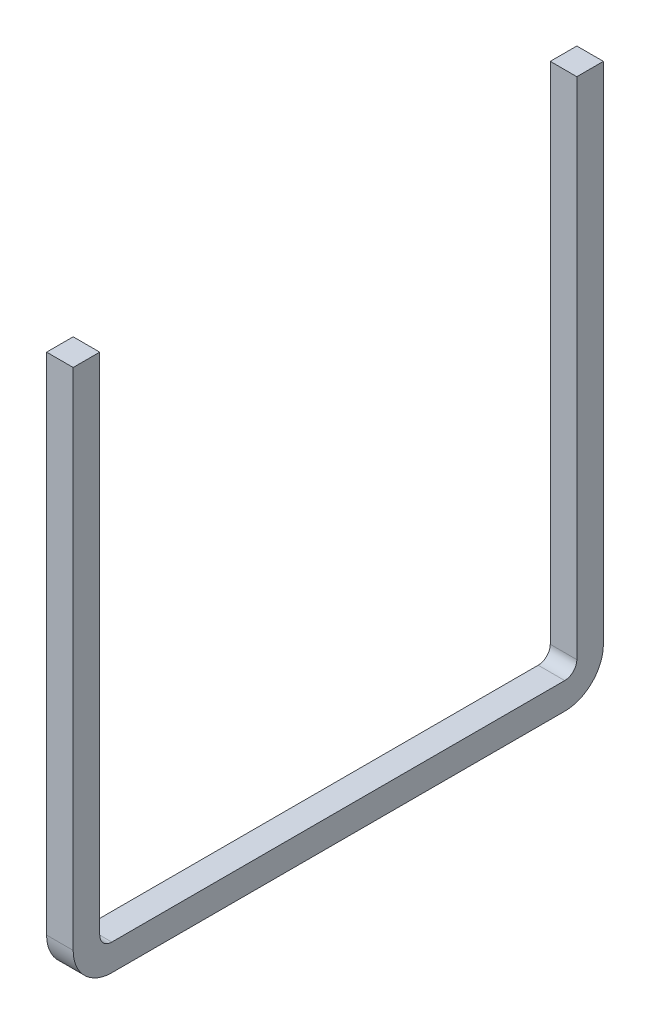
ISO-10303-21;
HEADER;
FILE_DESCRIPTION(('STEP AP214'),'2;1');
FILE_NAME('part.step','',(''),(''),'','','');
FILE_SCHEMA(('AUTOMOTIVE_DESIGN { 1 0 10303 214 1 1 1 1 }'));
ENDSEC;
DATA;
#1=APPLICATION_CONTEXT('core data for automotive mechanical design processes');
#2=APPLICATION_PROTOCOL_DEFINITION('international standard','automotive_design',2000,#1);
#3=PRODUCT_CONTEXT('',#1,'mechanical');
#4=PRODUCT('Part','Part','',(#3));
#5=PRODUCT_RELATED_PRODUCT_CATEGORY('part','',(#4));
#6=PRODUCT_DEFINITION_FORMATION('','',#4);
#7=PRODUCT_DEFINITION_CONTEXT('part definition',#1,'design');
#8=PRODUCT_DEFINITION('design','',#6,#7);
#9=PRODUCT_DEFINITION_SHAPE('','',#8);
#10=(LENGTH_UNIT() NAMED_UNIT(*) SI_UNIT(.MILLI.,.METRE.));
#11=(NAMED_UNIT(*) PLANE_ANGLE_UNIT() SI_UNIT($,.RADIAN.));
#12=(NAMED_UNIT(*) SI_UNIT($,.STERADIAN.) SOLID_ANGLE_UNIT());
#13=UNCERTAINTY_MEASURE_WITH_UNIT(LENGTH_MEASURE(1.E-05),#10,'distance_accuracy_value','');
#14=(GEOMETRIC_REPRESENTATION_CONTEXT(3) GLOBAL_UNCERTAINTY_ASSIGNED_CONTEXT((#13)) GLOBAL_UNIT_ASSIGNED_CONTEXT((#10,
#11,#12)) REPRESENTATION_CONTEXT('',''));
#15=CARTESIAN_POINT('',(0.,0.,0.));
#16=DIRECTION('',(0.,0.,1.));
#17=DIRECTION('',(1.,0.,0.));
#18=AXIS2_PLACEMENT_3D('',#15,#16,#17);
#19=CARTESIAN_POINT('',(5.588,114.3,-55.753));
#20=DIRECTION('',(0.,-1.,0.));
#21=DIRECTION('',(0.,0.,-1.));
#22=AXIS2_PLACEMENT_3D('',#19,#20,#21);
#23=PLANE('',#22);
#24=DIRECTION('',(0.,0.,1.));
#25=VECTOR('',#24,1.);
#26=CARTESIAN_POINT('',(0.,114.3,-55.753));
#27=LINE('',#26,#25);
#28=CARTESIAN_POINT('',(0.,114.3,-55.753));
#29=VERTEX_POINT('',#28);
#30=CARTESIAN_POINT('',(0.,114.3,-50.165));
#31=VERTEX_POINT('',#30);
#32=EDGE_CURVE('E162',#29,#31,#27,.T.);
#33=ORIENTED_EDGE('',*,*,#32,.T.);
#34=DIRECTION('',(-1.,0.,0.));
#35=VECTOR('',#34,1.);
#36=CARTESIAN_POINT('',(5.588,114.3,-50.165));
#37=LINE('',#36,#35);
#38=CARTESIAN_POINT('',(5.588,114.3,-50.165));
#39=VERTEX_POINT('',#38);
#40=EDGE_CURVE('E13',#39,#31,#37,.T.);
#41=ORIENTED_EDGE('',*,*,#40,.F.);
#42=DIRECTION('',(0.,0.,1.));
#43=VECTOR('',#42,1.);
#44=CARTESIAN_POINT('',(5.588,114.3,-55.753));
#45=LINE('',#44,#43);
#46=CARTESIAN_POINT('',(5.588,114.3,-55.753));
#47=VERTEX_POINT('',#46);
#48=EDGE_CURVE('E184',#47,#39,#45,.T.);
#49=ORIENTED_EDGE('',*,*,#48,.F.);
#50=DIRECTION('',(-1.,0.,0.));
#51=VECTOR('',#50,1.);
#52=CARTESIAN_POINT('',(5.588,114.3,-55.753));
#53=LINE('',#52,#51);
#54=EDGE_CURVE('E158',#47,#29,#53,.T.);
#55=ORIENTED_EDGE('',*,*,#54,.T.);
#56=EDGE_LOOP('',(#33,#41,#49,#55));
#57=FACE_BOUND('',#56,.T.);
#58=ADVANCED_FACE('F42',(#57),#23,.F.);
#59=CARTESIAN_POINT('',(5.588,114.3,-50.165));
#60=DIRECTION('',(0.,0.,-1.));
#61=DIRECTION('',(0.,1.,0.));
#62=AXIS2_PLACEMENT_3D('',#59,#60,#61);
#63=PLANE('',#62);
#64=DIRECTION('',(0.,-1.,0.));
#65=VECTOR('',#64,1.);
#66=CARTESIAN_POINT('',(0.,114.3,-50.165));
#67=LINE('',#66,#65);
#68=CARTESIAN_POINT('',(0.,8.128,-50.165));
#69=VERTEX_POINT('',#68);
#70=EDGE_CURVE('E165',#31,#69,#67,.T.);
#71=ORIENTED_EDGE('',*,*,#70,.T.);
#72=DIRECTION('',(-1.,0.,0.));
#73=VECTOR('',#72,1.);
#74=CARTESIAN_POINT('',(5.588,8.128,-50.165));
#75=LINE('',#74,#73);
#76=CARTESIAN_POINT('',(5.588,8.128,-50.165));
#77=VERTEX_POINT('',#76);
#78=EDGE_CURVE('E50',#77,#69,#75,.T.);
#79=ORIENTED_EDGE('',*,*,#78,.F.);
#80=DIRECTION('',(0.,-1.,0.));
#81=VECTOR('',#80,1.);
#82=CARTESIAN_POINT('',(5.588,114.3,-50.165));
#83=LINE('',#82,#81);
#84=EDGE_CURVE('E113',#39,#77,#83,.T.);
#85=ORIENTED_EDGE('',*,*,#84,.F.);
#86=ORIENTED_EDGE('',*,*,#40,.T.);
#87=EDGE_LOOP('',(#71,#79,#85,#86));
#88=FACE_BOUND('',#87,.T.);
#89=ADVANCED_FACE('F262',(#88),#63,.F.);
#90=CARTESIAN_POINT('',(5.588,8.128,-47.625));
#91=DIRECTION('',(-1.,0.,0.));
#92=DIRECTION('',(0.,0.,1.));
#93=AXIS2_PLACEMENT_3D('',#90,#91,#92);
#94=CYLINDRICAL_SURFACE('',#93,2.54);
#95=CARTESIAN_POINT('',(0.,8.128,-47.625));
#96=DIRECTION('',(-1.,0.,0.));
#97=DIRECTION('',(0.,0.,-1.));
#98=AXIS2_PLACEMENT_3D('',#95,#96,#97);
#99=CIRCLE('',#98,2.54);
#100=CARTESIAN_POINT('',(0.,5.588,-47.625));
#101=VERTEX_POINT('',#100);
#102=EDGE_CURVE('E167',#69,#101,#99,.T.);
#103=ORIENTED_EDGE('',*,*,#102,.T.);
#104=DIRECTION('',(-1.,0.,0.));
#105=VECTOR('',#104,1.);
#106=CARTESIAN_POINT('',(5.588,5.588,-47.625));
#107=LINE('',#106,#105);
#108=CARTESIAN_POINT('',(5.588,5.588,-47.625));
#109=VERTEX_POINT('',#108);
#110=EDGE_CURVE('E203',#109,#101,#107,.T.);
#111=ORIENTED_EDGE('',*,*,#110,.F.);
#112=CARTESIAN_POINT('',(5.588,8.128,-47.625));
#113=DIRECTION('',(-1.,0.,0.));
#114=DIRECTION('',(0.,0.,-1.));
#115=AXIS2_PLACEMENT_3D('',#112,#113,#114);
#116=CIRCLE('',#115,2.54);
#117=EDGE_CURVE('E211',#77,#109,#116,.T.);
#118=ORIENTED_EDGE('',*,*,#117,.F.);
#119=ORIENTED_EDGE('',*,*,#78,.T.);
#120=EDGE_LOOP('',(#103,#111,#118,#119));
#121=FACE_BOUND('',#120,.T.);
#122=ADVANCED_FACE('F209',(#121),#94,.F.);
#123=CARTESIAN_POINT('',(5.588,5.588,-47.625));
#124=DIRECTION('',(0.,-1.,0.));
#125=DIRECTION('',(0.,0.,-1.));
#126=AXIS2_PLACEMENT_3D('',#123,#124,#125);
#127=PLANE('',#126);
#128=DIRECTION('',(0.,0.,1.));
#129=VECTOR('',#128,1.);
#130=CARTESIAN_POINT('',(0.,5.588,-47.625));
#131=LINE('',#130,#129);
#132=CARTESIAN_POINT('',(0.,5.588,47.625));
#133=VERTEX_POINT('',#132);
#134=EDGE_CURVE('E169',#101,#133,#131,.T.);
#135=ORIENTED_EDGE('',*,*,#134,.T.);
#136=DIRECTION('',(-1.,0.,0.));
#137=VECTOR('',#136,1.);
#138=CARTESIAN_POINT('',(5.588,5.588,47.625));
#139=LINE('',#138,#137);
#140=CARTESIAN_POINT('',(5.588,5.588,47.625));
#141=VERTEX_POINT('',#140);
#142=EDGE_CURVE('E200',#141,#133,#139,.T.);
#143=ORIENTED_EDGE('',*,*,#142,.F.);
#144=DIRECTION('',(0.,0.,1.));
#145=VECTOR('',#144,1.);
#146=CARTESIAN_POINT('',(5.588,5.588,-47.625));
#147=LINE('',#146,#145);
#148=EDGE_CURVE('E229',#109,#141,#147,.T.);
#149=ORIENTED_EDGE('',*,*,#148,.F.);
#150=ORIENTED_EDGE('',*,*,#110,.T.);
#151=EDGE_LOOP('',(#135,#143,#149,#150));
#152=FACE_BOUND('',#151,.T.);
#153=ADVANCED_FACE('F220',(#152),#127,.F.);
#154=CARTESIAN_POINT('',(5.588,8.12799999999999,47.625));
#155=DIRECTION('',(-1.,0.,0.));
#156=DIRECTION('',(0.,0.,1.));
#157=AXIS2_PLACEMENT_3D('',#154,#155,#156);
#158=CYLINDRICAL_SURFACE('',#157,2.54);
#159=CARTESIAN_POINT('',(0.,8.12799999999999,47.625));
#160=DIRECTION('',(-1.,0.,0.));
#161=DIRECTION('',(0.,0.,-1.));
#162=AXIS2_PLACEMENT_3D('',#159,#160,#161);
#163=CIRCLE('',#162,2.54);
#164=CARTESIAN_POINT('',(0.,8.12799999999999,50.165));
#165=VERTEX_POINT('',#164);
#166=EDGE_CURVE('E171',#133,#165,#163,.T.);
#167=ORIENTED_EDGE('',*,*,#166,.T.);
#168=DIRECTION('',(-1.,0.,0.));
#169=VECTOR('',#168,1.);
#170=CARTESIAN_POINT('',(5.588,8.12799999999999,50.165));
#171=LINE('',#170,#169);
#172=CARTESIAN_POINT('',(5.588,8.12799999999999,50.165));
#173=VERTEX_POINT('',#172);
#174=EDGE_CURVE('E197',#173,#165,#171,.T.);
#175=ORIENTED_EDGE('',*,*,#174,.F.);
#176=CARTESIAN_POINT('',(5.588,8.12799999999999,47.625));
#177=DIRECTION('',(-1.,0.,0.));
#178=DIRECTION('',(0.,0.,-1.));
#179=AXIS2_PLACEMENT_3D('',#176,#177,#178);
#180=CIRCLE('',#179,2.54);
#181=EDGE_CURVE('E226',#141,#173,#180,.T.);
#182=ORIENTED_EDGE('',*,*,#181,.F.);
#183=ORIENTED_EDGE('',*,*,#142,.T.);
#184=EDGE_LOOP('',(#167,#175,#182,#183));
#185=FACE_BOUND('',#184,.T.);
#186=ADVANCED_FACE('F224',(#185),#158,.F.);
#187=CARTESIAN_POINT('',(5.588,8.12799999999999,50.165));
#188=DIRECTION('',(0.,0.,1.));
#189=DIRECTION('',(0.,-1.,0.));
#190=AXIS2_PLACEMENT_3D('',#187,#188,#189);
#191=PLANE('',#190);
#192=DIRECTION('',(0.,1.,0.));
#193=VECTOR('',#192,1.);
#194=CARTESIAN_POINT('',(0.,8.12799999999999,50.165));
#195=LINE('',#194,#193);
#196=CARTESIAN_POINT('',(0.,114.3,50.165));
#197=VERTEX_POINT('',#196);
#198=EDGE_CURVE('E173',#165,#197,#195,.T.);
#199=ORIENTED_EDGE('',*,*,#198,.T.);
#200=DIRECTION('',(-1.,0.,0.));
#201=VECTOR('',#200,1.);
#202=CARTESIAN_POINT('',(5.588,114.3,50.165));
#203=LINE('',#202,#201);
#204=CARTESIAN_POINT('',(5.588,114.3,50.165));
#205=VERTEX_POINT('',#204);
#206=EDGE_CURVE('E194',#205,#197,#203,.T.);
#207=ORIENTED_EDGE('',*,*,#206,.F.);
#208=DIRECTION('',(0.,1.,0.));
#209=VECTOR('',#208,1.);
#210=CARTESIAN_POINT('',(5.588,8.12799999999999,50.165));
#211=LINE('',#210,#209);
#212=EDGE_CURVE('E228',#173,#205,#211,.T.);
#213=ORIENTED_EDGE('',*,*,#212,.F.);
#214=ORIENTED_EDGE('',*,*,#174,.T.);
#215=EDGE_LOOP('',(#199,#207,#213,#214));
#216=FACE_BOUND('',#215,.T.);
#217=ADVANCED_FACE('F275',(#216),#191,.F.);
#218=CARTESIAN_POINT('',(5.588,114.3,50.165));
#219=DIRECTION('',(0.,-1.,0.));
#220=DIRECTION('',(0.,0.,-1.));
#221=AXIS2_PLACEMENT_3D('',#218,#219,#220);
#222=PLANE('',#221);
#223=DIRECTION('',(0.,0.,1.));
#224=VECTOR('',#223,1.);
#225=CARTESIAN_POINT('',(0.,114.3,50.165));
#226=LINE('',#225,#224);
#227=CARTESIAN_POINT('',(0.,114.3,55.753));
#228=VERTEX_POINT('',#227);
#229=EDGE_CURVE('E175',#197,#228,#226,.T.);
#230=ORIENTED_EDGE('',*,*,#229,.T.);
#231=DIRECTION('',(-1.,0.,0.));
#232=VECTOR('',#231,1.);
#233=CARTESIAN_POINT('',(5.588,114.3,55.753));
#234=LINE('',#233,#232);
#235=CARTESIAN_POINT('',(5.588,114.3,55.753));
#236=VERTEX_POINT('',#235);
#237=EDGE_CURVE('E191',#236,#228,#234,.T.);
#238=ORIENTED_EDGE('',*,*,#237,.F.);
#239=DIRECTION('',(0.,0.,1.));
#240=VECTOR('',#239,1.);
#241=CARTESIAN_POINT('',(5.588,114.3,50.165));
#242=LINE('',#241,#240);
#243=EDGE_CURVE('E231',#205,#236,#242,.T.);
#244=ORIENTED_EDGE('',*,*,#243,.F.);
#245=ORIENTED_EDGE('',*,*,#206,.T.);
#246=EDGE_LOOP('',(#230,#238,#244,#245));
#247=FACE_BOUND('',#246,.T.);
#248=ADVANCED_FACE('F278',(#247),#222,.F.);
#249=CARTESIAN_POINT('',(5.588,114.3,55.753));
#250=DIRECTION('',(0.,0.,-1.));
#251=DIRECTION('',(0.,1.,0.));
#252=AXIS2_PLACEMENT_3D('',#249,#250,#251);
#253=PLANE('',#252);
#254=DIRECTION('',(0.,-1.,0.));
#255=VECTOR('',#254,1.);
#256=CARTESIAN_POINT('',(0.,114.3,55.753));
#257=LINE('',#256,#255);
#258=CARTESIAN_POINT('',(0.,8.128,55.753));
#259=VERTEX_POINT('',#258);
#260=EDGE_CURVE('E177',#228,#259,#257,.T.);
#261=ORIENTED_EDGE('',*,*,#260,.T.);
#262=DIRECTION('',(-1.,0.,0.));
#263=VECTOR('',#262,1.);
#264=CARTESIAN_POINT('',(5.588,8.128,55.753));
#265=LINE('',#264,#263);
#266=CARTESIAN_POINT('',(5.588,8.128,55.753));
#267=VERTEX_POINT('',#266);
#268=EDGE_CURVE('E188',#267,#259,#265,.T.);
#269=ORIENTED_EDGE('',*,*,#268,.F.);
#270=DIRECTION('',(0.,-1.,0.));
#271=VECTOR('',#270,1.);
#272=CARTESIAN_POINT('',(5.588,114.3,55.753));
#273=LINE('',#272,#271);
#274=EDGE_CURVE('E237',#236,#267,#273,.T.);
#275=ORIENTED_EDGE('',*,*,#274,.F.);
#276=ORIENTED_EDGE('',*,*,#237,.T.);
#277=EDGE_LOOP('',(#261,#269,#275,#276));
#278=FACE_BOUND('',#277,.T.);
#279=ADVANCED_FACE('F243',(#278),#253,.F.);
#280=CARTESIAN_POINT('',(5.588,8.12799999999999,47.625));
#281=DIRECTION('',(-1.,0.,0.));
#282=DIRECTION('',(0.,0.,1.));
#283=AXIS2_PLACEMENT_3D('',#280,#281,#282);
#284=CYLINDRICAL_SURFACE('',#283,8.128);
#285=CARTESIAN_POINT('',(0.,8.12799999999999,47.625));
#286=DIRECTION('',(1.,0.,0.));
#287=DIRECTION('',(0.,0.,-1.));
#288=AXIS2_PLACEMENT_3D('',#285,#286,#287);
#289=CIRCLE('',#288,8.128);
#290=CARTESIAN_POINT('',(0.,0.,47.625));
#291=VERTEX_POINT('',#290);
#292=EDGE_CURVE('E179',#259,#291,#289,.T.);
#293=ORIENTED_EDGE('',*,*,#292,.T.);
#294=DIRECTION('',(-1.,0.,0.));
#295=VECTOR('',#294,1.);
#296=CARTESIAN_POINT('',(5.588,0.,47.625));
#297=LINE('',#296,#295);
#298=CARTESIAN_POINT('',(5.588,0.,47.625));
#299=VERTEX_POINT('',#298);
#300=EDGE_CURVE('E153',#299,#291,#297,.T.);
#301=ORIENTED_EDGE('',*,*,#300,.F.);
#302=CARTESIAN_POINT('',(5.588,8.12799999999999,47.625));
#303=DIRECTION('',(1.,0.,0.));
#304=DIRECTION('',(0.,0.,-1.));
#305=AXIS2_PLACEMENT_3D('',#302,#303,#304);
#306=CIRCLE('',#305,8.128);
#307=EDGE_CURVE('E144',#267,#299,#306,.T.);
#308=ORIENTED_EDGE('',*,*,#307,.F.);
#309=ORIENTED_EDGE('',*,*,#268,.T.);
#310=EDGE_LOOP('',(#293,#301,#308,#309));
#311=FACE_BOUND('',#310,.T.);
#312=ADVANCED_FACE('F247',(#311),#284,.T.);
#313=CARTESIAN_POINT('',(5.588,0.,47.625));
#314=DIRECTION('',(0.,1.,0.));
#315=DIRECTION('',(0.,0.,1.));
#316=AXIS2_PLACEMENT_3D('',#313,#314,#315);
#317=PLANE('',#316);
#318=DIRECTION('',(0.,0.,-1.));
#319=VECTOR('',#318,1.);
#320=CARTESIAN_POINT('',(0.,0.,47.625));
#321=LINE('',#320,#319);
#322=CARTESIAN_POINT('',(0.,0.,-47.625));
#323=VERTEX_POINT('',#322);
#324=EDGE_CURVE('E152',#291,#323,#321,.T.);
#325=ORIENTED_EDGE('',*,*,#324,.T.);
#326=DIRECTION('',(-1.,0.,0.));
#327=VECTOR('',#326,1.);
#328=CARTESIAN_POINT('',(5.588,0.,-47.625));
#329=LINE('',#328,#327);
#330=CARTESIAN_POINT('',(5.588,0.,-47.625));
#331=VERTEX_POINT('',#330);
#332=EDGE_CURVE('E149',#331,#323,#329,.T.);
#333=ORIENTED_EDGE('',*,*,#332,.F.);
#334=DIRECTION('',(0.,0.,-1.));
#335=VECTOR('',#334,1.);
#336=CARTESIAN_POINT('',(5.588,0.,47.625));
#337=LINE('',#336,#335);
#338=EDGE_CURVE('E138',#299,#331,#337,.T.);
#339=ORIENTED_EDGE('',*,*,#338,.F.);
#340=ORIENTED_EDGE('',*,*,#300,.T.);
#341=EDGE_LOOP('',(#325,#333,#339,#340));
#342=FACE_BOUND('',#341,.T.);
#343=ADVANCED_FACE('F150',(#342),#317,.F.);
#344=CARTESIAN_POINT('',(5.588,8.128,-47.625));
#345=DIRECTION('',(-1.,0.,0.));
#346=DIRECTION('',(0.,0.,1.));
#347=AXIS2_PLACEMENT_3D('',#344,#345,#346);
#348=CYLINDRICAL_SURFACE('',#347,8.12799999999999);
#349=CARTESIAN_POINT('',(0.,8.128,-47.625));
#350=DIRECTION('',(1.,0.,0.));
#351=DIRECTION('',(0.,0.,-1.));
#352=AXIS2_PLACEMENT_3D('',#349,#350,#351);
#353=CIRCLE('',#352,8.12799999999999);
#354=CARTESIAN_POINT('',(0.,8.128,-55.753));
#355=VERTEX_POINT('',#354);
#356=EDGE_CURVE('E99',#323,#355,#353,.T.);
#357=ORIENTED_EDGE('',*,*,#356,.T.);
#358=DIRECTION('',(-1.,0.,0.));
#359=VECTOR('',#358,1.);
#360=CARTESIAN_POINT('',(5.588,8.128,-55.753));
#361=LINE('',#360,#359);
#362=CARTESIAN_POINT('',(5.588,8.128,-55.753));
#363=VERTEX_POINT('',#362);
#364=EDGE_CURVE('E154',#363,#355,#361,.T.);
#365=ORIENTED_EDGE('',*,*,#364,.F.);
#366=CARTESIAN_POINT('',(5.588,8.128,-47.625));
#367=DIRECTION('',(1.,0.,0.));
#368=DIRECTION('',(0.,0.,-1.));
#369=AXIS2_PLACEMENT_3D('',#366,#367,#368);
#370=CIRCLE('',#369,8.12799999999999);
#371=EDGE_CURVE('E142',#331,#363,#370,.T.);
#372=ORIENTED_EDGE('',*,*,#371,.F.);
#373=ORIENTED_EDGE('',*,*,#332,.T.);
#374=EDGE_LOOP('',(#357,#365,#372,#373));
#375=FACE_BOUND('',#374,.T.);
#376=ADVANCED_FACE('F156',(#375),#348,.T.);
#377=CARTESIAN_POINT('',(5.588,8.128,-55.753));
#378=DIRECTION('',(0.,0.,1.));
#379=DIRECTION('',(0.,-1.,0.));
#380=AXIS2_PLACEMENT_3D('',#377,#378,#379);
#381=PLANE('',#380);
#382=DIRECTION('',(0.,1.,0.));
#383=VECTOR('',#382,1.);
#384=CARTESIAN_POINT('',(0.,8.128,-55.753));
#385=LINE('',#384,#383);
#386=EDGE_CURVE('E105',#355,#29,#385,.T.);
#387=ORIENTED_EDGE('',*,*,#386,.T.);
#388=ORIENTED_EDGE('',*,*,#54,.F.);
#389=DIRECTION('',(0.,1.,0.));
#390=VECTOR('',#389,1.);
#391=CARTESIAN_POINT('',(5.588,8.128,-55.753));
#392=LINE('',#391,#390);
#393=EDGE_CURVE('E58',#363,#47,#392,.T.);
#394=ORIENTED_EDGE('',*,*,#393,.F.);
#395=ORIENTED_EDGE('',*,*,#364,.T.);
#396=EDGE_LOOP('',(#387,#388,#394,#395));
#397=FACE_BOUND('',#396,.T.);
#398=ADVANCED_FACE('F251',(#397),#381,.F.);
#399=CARTESIAN_POINT('',(5.588,8.128,-47.625));
#400=DIRECTION('',(1.,0.,0.));
#401=DIRECTION('',(0.,0.,-1.));
#402=AXIS2_PLACEMENT_3D('',#399,#400,#401);
#403=PLANE('',#402);
#404=ORIENTED_EDGE('',*,*,#48,.T.);
#405=ORIENTED_EDGE('',*,*,#84,.T.);
#406=ORIENTED_EDGE('',*,*,#117,.T.);
#407=ORIENTED_EDGE('',*,*,#148,.T.);
#408=ORIENTED_EDGE('',*,*,#181,.T.);
#409=ORIENTED_EDGE('',*,*,#212,.T.);
#410=ORIENTED_EDGE('',*,*,#243,.T.);
#411=ORIENTED_EDGE('',*,*,#274,.T.);
#412=ORIENTED_EDGE('',*,*,#307,.T.);
#413=ORIENTED_EDGE('',*,*,#338,.T.);
#414=ORIENTED_EDGE('',*,*,#371,.T.);
#415=ORIENTED_EDGE('',*,*,#393,.T.);
#416=EDGE_LOOP('',(#404,#405,#406,#407,#408,#409,#410,#411,#412,#413,#414,#415));
#417=FACE_BOUND('',#416,.T.);
#418=ADVANCED_FACE('F140',(#417),#403,.T.);
#419=CARTESIAN_POINT('',(0.,8.128,-47.625));
#420=DIRECTION('',(1.,0.,0.));
#421=DIRECTION('',(0.,0.,-1.));
#422=AXIS2_PLACEMENT_3D('',#419,#420,#421);
#423=PLANE('',#422);
#424=ORIENTED_EDGE('',*,*,#32,.F.);
#425=ORIENTED_EDGE('',*,*,#386,.F.);
#426=ORIENTED_EDGE('',*,*,#356,.F.);
#427=ORIENTED_EDGE('',*,*,#324,.F.);
#428=ORIENTED_EDGE('',*,*,#292,.F.);
#429=ORIENTED_EDGE('',*,*,#260,.F.);
#430=ORIENTED_EDGE('',*,*,#229,.F.);
#431=ORIENTED_EDGE('',*,*,#198,.F.);
#432=ORIENTED_EDGE('',*,*,#166,.F.);
#433=ORIENTED_EDGE('',*,*,#134,.F.);
#434=ORIENTED_EDGE('',*,*,#102,.F.);
#435=ORIENTED_EDGE('',*,*,#70,.F.);
#436=EDGE_LOOP('',(#424,#425,#426,#427,#428,#429,#430,#431,#432,#433,#434,#435));
#437=FACE_BOUND('',#436,.T.);
#438=ADVANCED_FACE('F215',(#437),#423,.F.);
#439=CLOSED_SHELL('',(#58,#89,#122,#153,#186,#217,#248,#279,#312,#343,#376,#398,#418,#438));
#440=MANIFOLD_SOLID_BREP('B2',#439);
#441=ADVANCED_BREP_SHAPE_REPRESENTATION('',(#18,#440),#14);
#442=SHAPE_DEFINITION_REPRESENTATION(#9,#441);
ENDSEC;
END-ISO-10303-21;
